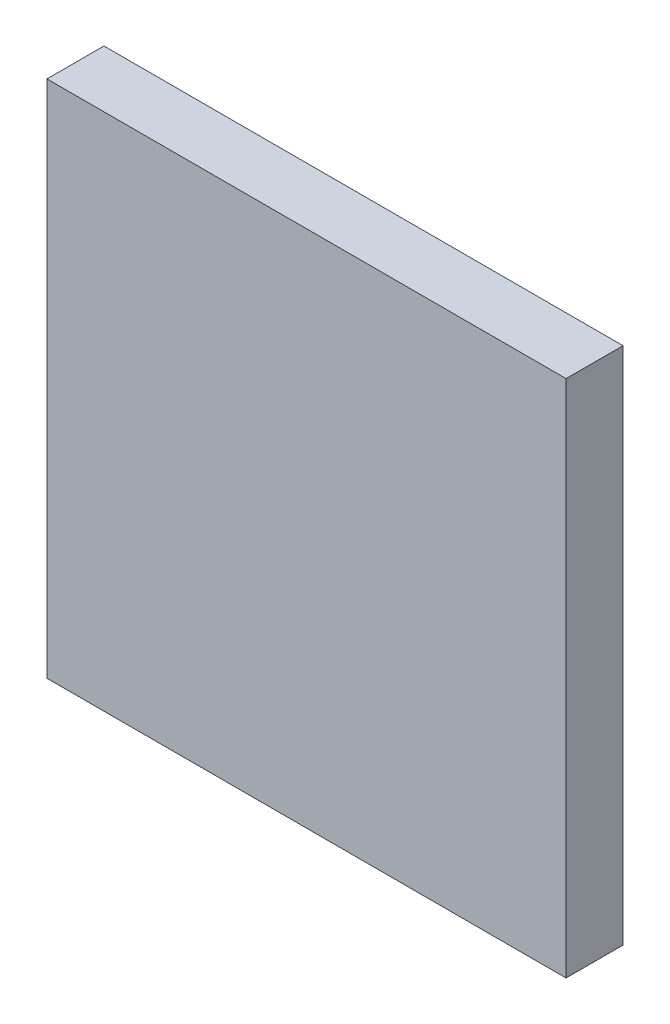
ISO-10303-21;
HEADER;
FILE_DESCRIPTION(('STEP AP214'),'2;1');
FILE_NAME('part.step','',(''),(''),'','','');
FILE_SCHEMA(('AUTOMOTIVE_DESIGN { 1 0 10303 214 1 1 1 1 }'));
ENDSEC;
DATA;
#1=APPLICATION_CONTEXT('core data for automotive mechanical design processes');
#2=APPLICATION_PROTOCOL_DEFINITION('international standard','automotive_design',2000,#1);
#3=PRODUCT_CONTEXT('',#1,'mechanical');
#4=PRODUCT('Part','Part','',(#3));
#5=PRODUCT_RELATED_PRODUCT_CATEGORY('part','',(#4));
#6=PRODUCT_DEFINITION_FORMATION('','',#4);
#7=PRODUCT_DEFINITION_CONTEXT('part definition',#1,'design');
#8=PRODUCT_DEFINITION('design','',#6,#7);
#9=PRODUCT_DEFINITION_SHAPE('','',#8);
#10=(LENGTH_UNIT() NAMED_UNIT(*) SI_UNIT(.MILLI.,.METRE.));
#11=(NAMED_UNIT(*) PLANE_ANGLE_UNIT() SI_UNIT($,.RADIAN.));
#12=(NAMED_UNIT(*) SI_UNIT($,.STERADIAN.) SOLID_ANGLE_UNIT());
#13=UNCERTAINTY_MEASURE_WITH_UNIT(LENGTH_MEASURE(1.E-05),#10,'distance_accuracy_value','');
#14=(GEOMETRIC_REPRESENTATION_CONTEXT(3) GLOBAL_UNCERTAINTY_ASSIGNED_CONTEXT((#13)) GLOBAL_UNIT_ASSIGNED_CONTEXT((#10,
#11,#12)) REPRESENTATION_CONTEXT('',''));
#15=CARTESIAN_POINT('',(0.,0.,0.));
#16=DIRECTION('',(0.,0.,1.));
#17=DIRECTION('',(1.,0.,0.));
#18=AXIS2_PLACEMENT_3D('',#15,#16,#17);
#19=CARTESIAN_POINT('',(20.5,-20.5,4.5));
#20=DIRECTION('',(-1.,0.,0.));
#21=DIRECTION('',(0.,0.,1.));
#22=AXIS2_PLACEMENT_3D('',#19,#20,#21);
#23=PLANE('',#22);
#24=DIRECTION('',(0.,1.,0.));
#25=VECTOR('',#24,1.);
#26=CARTESIAN_POINT('',(20.5,-20.5,0.));
#27=LINE('',#26,#25);
#28=CARTESIAN_POINT('',(20.5,-20.5,0.));
#29=VERTEX_POINT('',#28);
#30=CARTESIAN_POINT('',(20.5,20.5,0.));
#31=VERTEX_POINT('',#30);
#32=EDGE_CURVE('E96',#29,#31,#27,.T.);
#33=ORIENTED_EDGE('',*,*,#32,.T.);
#34=DIRECTION('',(0.,0.,-1.));
#35=VECTOR('',#34,1.);
#36=CARTESIAN_POINT('',(20.5,20.5,4.5));
#37=LINE('',#36,#35);
#38=CARTESIAN_POINT('',(20.5,20.5,4.5));
#39=VERTEX_POINT('',#38);
#40=EDGE_CURVE('E11',#39,#31,#37,.T.);
#41=ORIENTED_EDGE('',*,*,#40,.F.);
#42=DIRECTION('',(0.,1.,0.));
#43=VECTOR('',#42,1.);
#44=CARTESIAN_POINT('',(20.5,-20.5,4.5));
#45=LINE('',#44,#43);
#46=CARTESIAN_POINT('',(20.5,-20.5,4.5));
#47=VERTEX_POINT('',#46);
#48=EDGE_CURVE('E84',#47,#39,#45,.T.);
#49=ORIENTED_EDGE('',*,*,#48,.F.);
#50=DIRECTION('',(0.,0.,-1.));
#51=VECTOR('',#50,1.);
#52=CARTESIAN_POINT('',(20.5,-20.5,4.5));
#53=LINE('',#52,#51);
#54=EDGE_CURVE('E92',#47,#29,#53,.T.);
#55=ORIENTED_EDGE('',*,*,#54,.T.);
#56=EDGE_LOOP('',(#33,#41,#49,#55));
#57=FACE_BOUND('',#56,.T.);
#58=ADVANCED_FACE('F33',(#57),#23,.F.);
#59=CARTESIAN_POINT('',(-20.5,20.5,4.5));
#60=DIRECTION('',(0.,-1.,0.));
#61=DIRECTION('',(0.,0.,-1.));
#62=AXIS2_PLACEMENT_3D('',#59,#60,#61);
#63=PLANE('',#62);
#64=DIRECTION('',(-1.,0.,0.));
#65=VECTOR('',#64,1.);
#66=CARTESIAN_POINT('',(-20.5,20.5,0.));
#67=LINE('',#66,#65);
#68=CARTESIAN_POINT('',(-20.5,20.5,0.));
#69=VERTEX_POINT('',#68);
#70=EDGE_CURVE('E88',#31,#69,#67,.T.);
#71=ORIENTED_EDGE('',*,*,#70,.T.);
#72=DIRECTION('',(0.,0.,-1.));
#73=VECTOR('',#72,1.);
#74=CARTESIAN_POINT('',(-20.5,20.5,4.5));
#75=LINE('',#74,#73);
#76=CARTESIAN_POINT('',(-20.5,20.5,4.5));
#77=VERTEX_POINT('',#76);
#78=EDGE_CURVE('E41',#77,#69,#75,.T.);
#79=ORIENTED_EDGE('',*,*,#78,.F.);
#80=DIRECTION('',(-1.,0.,0.));
#81=VECTOR('',#80,1.);
#82=CARTESIAN_POINT('',(-20.5,20.5,4.5));
#83=LINE('',#82,#81);
#84=EDGE_CURVE('E79',#39,#77,#83,.T.);
#85=ORIENTED_EDGE('',*,*,#84,.F.);
#86=ORIENTED_EDGE('',*,*,#40,.T.);
#87=EDGE_LOOP('',(#71,#79,#85,#86));
#88=FACE_BOUND('',#87,.T.);
#89=ADVANCED_FACE('F87',(#88),#63,.F.);
#90=CARTESIAN_POINT('',(-20.5,-20.5,4.5));
#91=DIRECTION('',(1.,0.,0.));
#92=DIRECTION('',(0.,0.,-1.));
#93=AXIS2_PLACEMENT_3D('',#90,#91,#92);
#94=PLANE('',#93);
#95=DIRECTION('',(0.,-1.,0.));
#96=VECTOR('',#95,1.);
#97=CARTESIAN_POINT('',(-20.5,-20.5,0.));
#98=LINE('',#97,#96);
#99=CARTESIAN_POINT('',(-20.5,-20.5,0.));
#100=VERTEX_POINT('',#99);
#101=EDGE_CURVE('E66',#69,#100,#98,.T.);
#102=ORIENTED_EDGE('',*,*,#101,.T.);
#103=DIRECTION('',(0.,0.,-1.));
#104=VECTOR('',#103,1.);
#105=CARTESIAN_POINT('',(-20.5,-20.5,4.5));
#106=LINE('',#105,#104);
#107=CARTESIAN_POINT('',(-20.5,-20.5,4.5));
#108=VERTEX_POINT('',#107);
#109=EDGE_CURVE('E89',#108,#100,#106,.T.);
#110=ORIENTED_EDGE('',*,*,#109,.F.);
#111=DIRECTION('',(0.,-1.,0.));
#112=VECTOR('',#111,1.);
#113=CARTESIAN_POINT('',(-20.5,-20.5,4.5));
#114=LINE('',#113,#112);
#115=EDGE_CURVE('E82',#77,#108,#114,.T.);
#116=ORIENTED_EDGE('',*,*,#115,.F.);
#117=ORIENTED_EDGE('',*,*,#78,.T.);
#118=EDGE_LOOP('',(#102,#110,#116,#117));
#119=FACE_BOUND('',#118,.T.);
#120=ADVANCED_FACE('F90',(#119),#94,.F.);
#121=CARTESIAN_POINT('',(-20.5,-20.5,4.5));
#122=DIRECTION('',(0.,1.,0.));
#123=DIRECTION('',(0.,0.,1.));
#124=AXIS2_PLACEMENT_3D('',#121,#122,#123);
#125=PLANE('',#124);
#126=DIRECTION('',(1.,0.,0.));
#127=VECTOR('',#126,1.);
#128=CARTESIAN_POINT('',(-20.5,-20.5,0.));
#129=LINE('',#128,#127);
#130=EDGE_CURVE('E72',#100,#29,#129,.T.);
#131=ORIENTED_EDGE('',*,*,#130,.T.);
#132=ORIENTED_EDGE('',*,*,#54,.F.);
#133=DIRECTION('',(1.,0.,0.));
#134=VECTOR('',#133,1.);
#135=CARTESIAN_POINT('',(-20.5,-20.5,4.5));
#136=LINE('',#135,#134);
#137=EDGE_CURVE('E49',#108,#47,#136,.T.);
#138=ORIENTED_EDGE('',*,*,#137,.F.);
#139=ORIENTED_EDGE('',*,*,#109,.T.);
#140=EDGE_LOOP('',(#131,#132,#138,#139));
#141=FACE_BOUND('',#140,.T.);
#142=ADVANCED_FACE('F103',(#141),#125,.F.);
#143=CARTESIAN_POINT('',(0.,0.,4.5));
#144=DIRECTION('',(0.,0.,-1.));
#145=DIRECTION('',(-1.,0.,0.));
#146=AXIS2_PLACEMENT_3D('',#143,#144,#145);
#147=PLANE('',#146);
#148=ORIENTED_EDGE('',*,*,#48,.T.);
#149=ORIENTED_EDGE('',*,*,#84,.T.);
#150=ORIENTED_EDGE('',*,*,#115,.T.);
#151=ORIENTED_EDGE('',*,*,#137,.T.);
#152=EDGE_LOOP('',(#148,#149,#150,#151));
#153=FACE_BOUND('',#152,.T.);
#154=ADVANCED_FACE('F80',(#153),#147,.F.);
#155=CARTESIAN_POINT('',(0.,0.,0.));
#156=DIRECTION('',(0.,0.,-1.));
#157=DIRECTION('',(-1.,0.,0.));
#158=AXIS2_PLACEMENT_3D('',#155,#156,#157);
#159=PLANE('',#158);
#160=ORIENTED_EDGE('',*,*,#32,.F.);
#161=ORIENTED_EDGE('',*,*,#130,.F.);
#162=ORIENTED_EDGE('',*,*,#101,.F.);
#163=ORIENTED_EDGE('',*,*,#70,.F.);
#164=EDGE_LOOP('',(#160,#161,#162,#163));
#165=FACE_BOUND('',#164,.T.);
#166=ADVANCED_FACE('F106',(#165),#159,.T.);
#167=CLOSED_SHELL('',(#58,#89,#120,#142,#154,#166));
#168=MANIFOLD_SOLID_BREP('B2',#167);
#169=ADVANCED_BREP_SHAPE_REPRESENTATION('',(#18,#168),#14);
#170=SHAPE_DEFINITION_REPRESENTATION(#9,#169);
ENDSEC;
END-ISO-10303-21;
